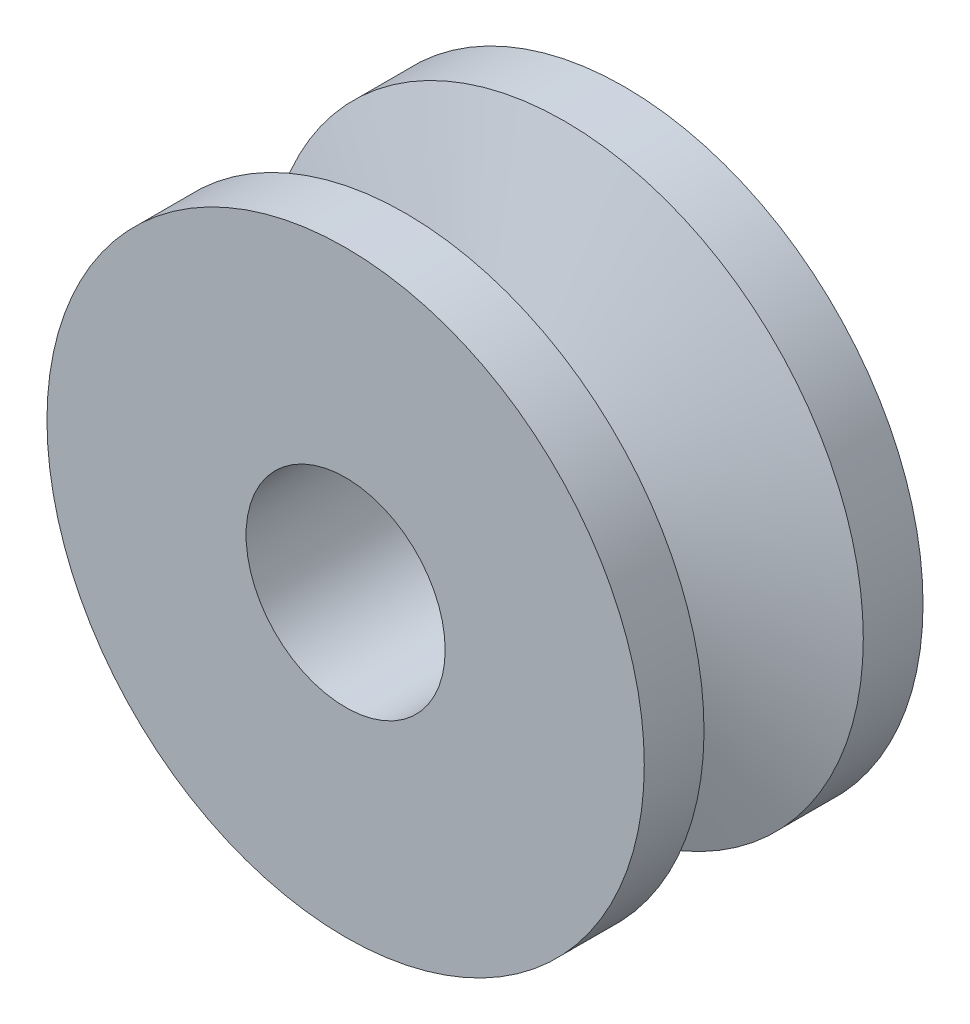
ISO-10303-21;
HEADER;
FILE_DESCRIPTION(('STEP AP214'),'2;1');
FILE_NAME('part.step','',(''),(''),'','','');
FILE_SCHEMA(('AUTOMOTIVE_DESIGN { 1 0 10303 214 1 1 1 1 }'));
ENDSEC;
DATA;
#1=APPLICATION_CONTEXT('core data for automotive mechanical design processes');
#2=APPLICATION_PROTOCOL_DEFINITION('international standard','automotive_design',2000,#1);
#3=PRODUCT_CONTEXT('',#1,'mechanical');
#4=PRODUCT('Part','Part','',(#3));
#5=PRODUCT_RELATED_PRODUCT_CATEGORY('part','',(#4));
#6=PRODUCT_DEFINITION_FORMATION('','',#4);
#7=PRODUCT_DEFINITION_CONTEXT('part definition',#1,'design');
#8=PRODUCT_DEFINITION('design','',#6,#7);
#9=PRODUCT_DEFINITION_SHAPE('','',#8);
#10=(LENGTH_UNIT() NAMED_UNIT(*) SI_UNIT(.MILLI.,.METRE.));
#11=(NAMED_UNIT(*) PLANE_ANGLE_UNIT() SI_UNIT($,.RADIAN.));
#12=(NAMED_UNIT(*) SI_UNIT($,.STERADIAN.) SOLID_ANGLE_UNIT());
#13=UNCERTAINTY_MEASURE_WITH_UNIT(LENGTH_MEASURE(1.E-05),#10,'distance_accuracy_value','');
#14=(GEOMETRIC_REPRESENTATION_CONTEXT(3) GLOBAL_UNCERTAINTY_ASSIGNED_CONTEXT((#13)) GLOBAL_UNIT_ASSIGNED_CONTEXT((#10,
#11,#12)) REPRESENTATION_CONTEXT('',''));
#15=CARTESIAN_POINT('',(0.,0.,0.));
#16=DIRECTION('',(0.,0.,1.));
#17=DIRECTION('',(1.,0.,0.));
#18=AXIS2_PLACEMENT_3D('',#15,#16,#17);
#19=CARTESIAN_POINT('',(0.,0.,0.));
#20=DIRECTION('',(0.,0.,-1.));
#21=DIRECTION('',(-1.,0.,0.));
#22=AXIS2_PLACEMENT_3D('',#19,#20,#21);
#23=CYLINDRICAL_SURFACE('',#22,3.);
#24=CARTESIAN_POINT('',(0.,0.,3.));
#25=DIRECTION('',(0.,0.,-1.));
#26=DIRECTION('',(-1.,0.,0.));
#27=AXIS2_PLACEMENT_3D('',#24,#25,#26);
#28=CIRCLE('',#27,3.);
#29=CARTESIAN_POINT('',(-0.76811457478686,-2.9,3.));
#30=VERTEX_POINT('',#29);
#31=CARTESIAN_POINT('',(0.76811457478686,-2.9,3.));
#32=VERTEX_POINT('',#31);
#33=EDGE_CURVE('E191',#30,#32,#28,.T.);
#34=ORIENTED_EDGE('',*,*,#33,.F.);
#35=DIRECTION('',(0.,0.,-1.));
#36=VECTOR('',#35,1.);
#37=CARTESIAN_POINT('',(-0.76811457478686,-2.9,7.001));
#38=LINE('',#37,#36);
#39=CARTESIAN_POINT('',(-0.768114574786862,-2.9,3.99999999999999));
#40=VERTEX_POINT('',#39);
#41=EDGE_CURVE('E71',#40,#30,#38,.T.);
#42=ORIENTED_EDGE('',*,*,#41,.F.);
#43=CARTESIAN_POINT('',(0.,0.,4.));
#44=DIRECTION('',(0.,0.,-1.));
#45=DIRECTION('',(-1.,0.,0.));
#46=AXIS2_PLACEMENT_3D('',#43,#44,#45);
#47=CIRCLE('',#46,3.);
#48=CARTESIAN_POINT('',(0.76811457478686,-2.9,4.));
#49=VERTEX_POINT('',#48);
#50=EDGE_CURVE('E188',#40,#49,#47,.T.);
#51=ORIENTED_EDGE('',*,*,#50,.T.);
#52=DIRECTION('',(0.,0.,-1.));
#53=VECTOR('',#52,1.);
#54=CARTESIAN_POINT('',(0.76811457478686,-2.9,7.001));
#55=LINE('',#54,#53);
#56=EDGE_CURVE('E85',#49,#32,#55,.T.);
#57=ORIENTED_EDGE('',*,*,#56,.T.);
#58=EDGE_LOOP('',(#34,#42,#51,#57));
#59=FACE_BOUND('',#58,.T.);
#60=ADVANCED_FACE('F33',(#59),#23,.T.);
#61=CARTESIAN_POINT('',(0.,0.,7.));
#62=DIRECTION('',(0.,0.,-1.));
#63=DIRECTION('',(-1.,0.,0.));
#64=AXIS2_PLACEMENT_3D('',#61,#62,#63);
#65=CYLINDRICAL_SURFACE('',#64,7.5);
#66=CARTESIAN_POINT('',(0.,0.,0.));
#67=DIRECTION('',(0.,0.,1.));
#68=DIRECTION('',(1.,0.,0.));
#69=AXIS2_PLACEMENT_3D('',#66,#67,#68);
#70=CIRCLE('',#69,7.5);
#71=CARTESIAN_POINT('',(7.5,0.,0.));
#72=VERTEX_POINT('',#71);
#73=EDGE_CURVE('E37',#72,#72,#70,.T.);
#74=ORIENTED_EDGE('',*,*,#73,.T.);
#75=EDGE_LOOP('',(#74));
#76=FACE_BOUND('',#75,.T.);
#77=CARTESIAN_POINT('',(0.,0.,1.5));
#78=DIRECTION('',(0.,0.,-1.));
#79=DIRECTION('',(-1.,0.,0.));
#80=AXIS2_PLACEMENT_3D('',#77,#78,#79);
#81=CIRCLE('',#80,7.5);
#82=CARTESIAN_POINT('',(-7.5,0.,1.5));
#83=VERTEX_POINT('',#82);
#84=EDGE_CURVE('E94',#83,#83,#81,.T.);
#85=ORIENTED_EDGE('',*,*,#84,.T.);
#86=EDGE_LOOP('',(#85));
#87=FACE_BOUND('',#86,.T.);
#88=ADVANCED_FACE('F35',(#76,#87),#65,.T.);
#89=CARTESIAN_POINT('',(0.,0.,7.));
#90=DIRECTION('',(0.,0.,1.));
#91=DIRECTION('',(1.,0.,0.));
#92=AXIS2_PLACEMENT_3D('',#89,#90,#91);
#93=CIRCLE('',#92,7.5);
#94=CARTESIAN_POINT('',(7.5,0.,7.));
#95=VERTEX_POINT('',#94);
#96=EDGE_CURVE('E11',#95,#95,#93,.T.);
#97=ORIENTED_EDGE('',*,*,#96,.F.);
#98=EDGE_LOOP('',(#97));
#99=FACE_BOUND('',#98,.T.);
#100=CARTESIAN_POINT('',(0.,0.,5.5));
#101=DIRECTION('',(0.,0.,-1.));
#102=DIRECTION('',(-1.,0.,0.));
#103=AXIS2_PLACEMENT_3D('',#100,#101,#102);
#104=CIRCLE('',#103,7.5);
#105=CARTESIAN_POINT('',(-7.5,0.,5.5));
#106=VERTEX_POINT('',#105);
#107=EDGE_CURVE('E186',#106,#106,#104,.T.);
#108=ORIENTED_EDGE('',*,*,#107,.F.);
#109=EDGE_LOOP('',(#108));
#110=FACE_BOUND('',#109,.T.);
#111=ADVANCED_FACE('F116',(#99,#110),#65,.T.);
#112=CARTESIAN_POINT('',(0.,0.,7.));
#113=DIRECTION('',(0.,0.,1.));
#114=DIRECTION('',(1.,0.,0.));
#115=AXIS2_PLACEMENT_3D('',#112,#113,#114);
#116=PLANE('',#115);
#117=ORIENTED_EDGE('',*,*,#96,.T.);
#118=EDGE_LOOP('',(#117));
#119=FACE_BOUND('',#118,.T.);
#120=CARTESIAN_POINT('',(0.,0.,7.));
#121=DIRECTION('',(0.,0.,1.));
#122=DIRECTION('',(1.,0.,0.));
#123=AXIS2_PLACEMENT_3D('',#120,#121,#122);
#124=CIRCLE('',#123,2.5);
#125=CARTESIAN_POINT('',(2.5,0.,7.));
#126=VERTEX_POINT('',#125);
#127=EDGE_CURVE('E198',#126,#126,#124,.T.);
#128=ORIENTED_EDGE('',*,*,#127,.F.);
#129=EDGE_LOOP('',(#128));
#130=FACE_BOUND('',#129,.T.);
#131=ADVANCED_FACE('F114',(#119,#130),#116,.T.);
#132=CARTESIAN_POINT('',(0.,0.,0.));
#133=DIRECTION('',(0.,0.,1.));
#134=DIRECTION('',(1.,0.,0.));
#135=AXIS2_PLACEMENT_3D('',#132,#133,#134);
#136=PLANE('',#135);
#137=DIRECTION('',(-1.,0.,0.));
#138=VECTOR('',#137,1.);
#139=CARTESIAN_POINT('',(-0.76811457478686,-2.9,0.));
#140=LINE('',#139,#138);
#141=CARTESIAN_POINT('',(0.76811457478686,-2.9,0.));
#142=VERTEX_POINT('',#141);
#143=CARTESIAN_POINT('',(-0.76811457478686,-2.9,0.));
#144=VERTEX_POINT('',#143);
#145=EDGE_CURVE('E48',#142,#144,#140,.T.);
#146=ORIENTED_EDGE('',*,*,#145,.T.);
#147=CARTESIAN_POINT('',(0.,0.,0.));
#148=DIRECTION('',(0.,0.,1.));
#149=DIRECTION('',(1.,0.,0.));
#150=AXIS2_PLACEMENT_3D('',#147,#148,#149);
#151=CIRCLE('',#150,3.);
#152=EDGE_CURVE('E76',#144,#142,#151,.T.);
#153=ORIENTED_EDGE('',*,*,#152,.T.);
#154=EDGE_LOOP('',(#146,#153));
#155=FACE_BOUND('',#154,.T.);
#156=ORIENTED_EDGE('',*,*,#73,.F.);
#157=EDGE_LOOP('',(#156));
#158=FACE_BOUND('',#157,.T.);
#159=CARTESIAN_POINT('',(0.,0.,0.));
#160=DIRECTION('',(0.,0.,1.));
#161=DIRECTION('',(1.,0.,0.));
#162=AXIS2_PLACEMENT_3D('',#159,#160,#161);
#163=CIRCLE('',#162,2.5);
#164=CARTESIAN_POINT('',(2.5,0.,0.));
#165=VERTEX_POINT('',#164);
#166=EDGE_CURVE('E197',#165,#165,#163,.T.);
#167=ORIENTED_EDGE('',*,*,#166,.T.);
#168=EDGE_LOOP('',(#167));
#169=FACE_BOUND('',#168,.T.);
#170=ADVANCED_FACE('F81',(#155,#158,#169),#136,.F.);
#171=CARTESIAN_POINT('',(0.,0.,7.));
#172=DIRECTION('',(0.,0.,-1.));
#173=DIRECTION('',(-1.,0.,0.));
#174=AXIS2_PLACEMENT_3D('',#171,#172,#173);
#175=CYLINDRICAL_SURFACE('',#174,2.5);
#176=ORIENTED_EDGE('',*,*,#127,.T.);
#177=EDGE_LOOP('',(#176));
#178=FACE_BOUND('',#177,.T.);
#179=ORIENTED_EDGE('',*,*,#166,.F.);
#180=EDGE_LOOP('',(#179));
#181=FACE_BOUND('',#180,.T.);
#182=ADVANCED_FACE('F109',(#178,#181),#175,.F.);
#183=CARTESIAN_POINT('',(0.,0.,1.5));
#184=DIRECTION('',(0.,0.,-1.));
#185=DIRECTION('',(-1.,0.,0.));
#186=AXIS2_PLACEMENT_3D('',#183,#184,#185);
#187=CONICAL_SURFACE('',#186,7.5,1.24904577239825);
#188=EDGE_CURVE('E194',#32,#30,#28,.T.);
#189=ORIENTED_EDGE('',*,*,#188,.T.);
#190=ORIENTED_EDGE('',*,*,#33,.T.);
#191=EDGE_LOOP('',(#189,#190));
#192=FACE_BOUND('',#191,.T.);
#193=ORIENTED_EDGE('',*,*,#84,.F.);
#194=EDGE_LOOP('',(#193));
#195=FACE_BOUND('',#194,.T.);
#196=ADVANCED_FACE('F102',(#192,#195),#187,.T.);
#197=CARTESIAN_POINT('',(0.,0.,4.));
#198=DIRECTION('',(0.,0.,1.));
#199=DIRECTION('',(1.,0.,0.));
#200=AXIS2_PLACEMENT_3D('',#197,#198,#199);
#201=CONICAL_SURFACE('',#200,3.,1.24904577239825);
#202=ORIENTED_EDGE('',*,*,#107,.T.);
#203=EDGE_LOOP('',(#202));
#204=FACE_BOUND('',#203,.T.);
#205=ORIENTED_EDGE('',*,*,#50,.F.);
#206=CARTESIAN_POINT('',(-3.34474189842988,-2.9,4.47562786512922));
#207=CARTESIAN_POINT('',(-3.22146944899,-2.9,4.44459541410723));
#208=CARTESIAN_POINT('',(-3.09802484764017,-2.9,4.41422941052173));
#209=CARTESIAN_POINT('',(-2.85070900397958,-2.9,4.35519560810183));
#210=CARTESIAN_POINT('',(-2.72683769285889,-2.9,4.32652809816703));
#211=CARTESIAN_POINT('',(-2.4781452434949,-2.9,4.27115992104296));
#212=CARTESIAN_POINT('',(-2.35332228484106,-2.9,4.24446733610962));
#213=CARTESIAN_POINT('',(-2.1031630359933,-2.9,4.19366176025311));
#214=CARTESIAN_POINT('',(-1.97782676571458,-2.9,4.16954867021828));
#215=CARTESIAN_POINT('',(-1.60590016130675,-2.9,4.1028152889358));
#216=CARTESIAN_POINT('',(-1.35845317549168,-2.9,4.06465939985268));
#217=CARTESIAN_POINT('',(-0.985972389228777,-2.9,4.02028055818272));
#218=CARTESIAN_POINT('',(-0.861697645311756,-2.9,4.00763529866164));
#219=CARTESIAN_POINT('',(-0.612755252281921,-2.9,3.98719165972133));
#220=CARTESIAN_POINT('',(-0.488087650773033,-2.9,3.97939271416141));
#221=CARTESIAN_POINT('',(-0.237856119160214,-2.9,3.96902527696302));
#222=CARTESIAN_POINT('',(-0.112290988803901,-2.9,3.96648531153235));
#223=CARTESIAN_POINT('',(0.13883163434608,-2.9,3.96686826324266));
#224=CARTESIAN_POINT('',(0.264389127094252,-2.9,3.9697912102427));
#225=CARTESIAN_POINT('',(0.515477827952632,-2.9,3.98094062875429));
#226=CARTESIAN_POINT('',(0.64100862893658,-2.9,3.98917610291719));
#227=CARTESIAN_POINT('',(0.891649444930358,-2.9,4.01051945088767));
#228=CARTESIAN_POINT('',(1.01675945645685,-2.9,4.02362736493008));
#229=CARTESIAN_POINT('',(1.26886880865845,-2.9,4.05440832678278));
#230=CARTESIAN_POINT('',(1.39585781781137,-2.9,4.07216486526372));
#231=CARTESIAN_POINT('',(1.64925980464336,-2.9,4.11142904626213));
#232=CARTESIAN_POINT('',(1.77567272926574,-2.9,4.13293702739433));
#233=CARTESIAN_POINT('',(2.02752568412885,-2.9,4.17897219408407));
#234=CARTESIAN_POINT('',(2.15296752999449,-2.9,4.20348955810432));
#235=CARTESIAN_POINT('',(2.40328996483578,-2.9,4.25504393186741));
#236=CARTESIAN_POINT('',(2.52817072950862,-2.9,4.28208008544753));
#237=CARTESIAN_POINT('',(2.65281681479381,-2.9,4.3101075890023));
#238=B_SPLINE_CURVE_WITH_KNOTS('',3,(#206,#207,#208,#209,#210,#211,#212,#213,#214,#215,#216,
#217,#218,#219,#220,#221,#222,#223,#224,#225,#226,#227,#228,#229,#230,#231,#232,#233,#234,#235,
#236,#237),.UNSPECIFIED.,.F.,.F.,(4,2,2,2,2,2,2,2,2,2,2,2,2,2,2,4),(0.,0.381359410536516,
0.762783501997674,1.14569088693327,1.52858355417027,2.27917290262202,2.65384486149047,
3.02847304338919,3.40512804775683,3.78178511084296,4.15908214278202,4.53638229037124,
4.92098907526426,5.30563059372215,5.68904859018928,6.07233673112347),.UNSPECIFIED.);
#239=EDGE_CURVE('E55',#40,#49,#238,.T.);
#240=ORIENTED_EDGE('',*,*,#239,.T.);
#241=EDGE_LOOP('',(#205,#240));
#242=FACE_BOUND('',#241,.T.);
#243=ADVANCED_FACE('F98',(#204,#242),#201,.T.);
#244=CARTESIAN_POINT('',(-0.76811457478686,-2.9,7.001));
#245=DIRECTION('',(0.,-1.,0.));
#246=DIRECTION('',(0.,0.,-1.));
#247=AXIS2_PLACEMENT_3D('',#244,#245,#246);
#248=PLANE('',#247);
#249=ORIENTED_EDGE('',*,*,#41,.T.);
#250=EDGE_CURVE('E67',#30,#144,#38,.T.);
#251=ORIENTED_EDGE('',*,*,#250,.T.);
#252=ORIENTED_EDGE('',*,*,#145,.F.);
#253=EDGE_CURVE('E78',#32,#142,#55,.T.);
#254=ORIENTED_EDGE('',*,*,#253,.F.);
#255=ORIENTED_EDGE('',*,*,#56,.F.);
#256=ORIENTED_EDGE('',*,*,#239,.F.);
#257=EDGE_LOOP('',(#249,#251,#252,#254,#255,#256));
#258=FACE_BOUND('',#257,.T.);
#259=ADVANCED_FACE('F69',(#258),#248,.T.);
#260=CARTESIAN_POINT('',(0.,0.,7.001));
#261=DIRECTION('',(0.,0.,-1.));
#262=DIRECTION('',(-1.,0.,0.));
#263=AXIS2_PLACEMENT_3D('',#260,#261,#262);
#264=CYLINDRICAL_SURFACE('',#263,3.);
#265=ORIENTED_EDGE('',*,*,#253,.T.);
#266=ORIENTED_EDGE('',*,*,#152,.F.);
#267=ORIENTED_EDGE('',*,*,#250,.F.);
#268=ORIENTED_EDGE('',*,*,#188,.F.);
#269=EDGE_LOOP('',(#265,#266,#267,#268));
#270=FACE_BOUND('',#269,.T.);
#271=ADVANCED_FACE('F77',(#270),#264,.F.);
#272=CLOSED_SHELL('',(#60,#88,#111,#131,#170,#182,#196,#243,#259,#271));
#273=MANIFOLD_SOLID_BREP('B2',#272);
#274=ADVANCED_BREP_SHAPE_REPRESENTATION('',(#18,#273),#14);
#275=SHAPE_DEFINITION_REPRESENTATION(#9,#274);
ENDSEC;
END-ISO-10303-21;
